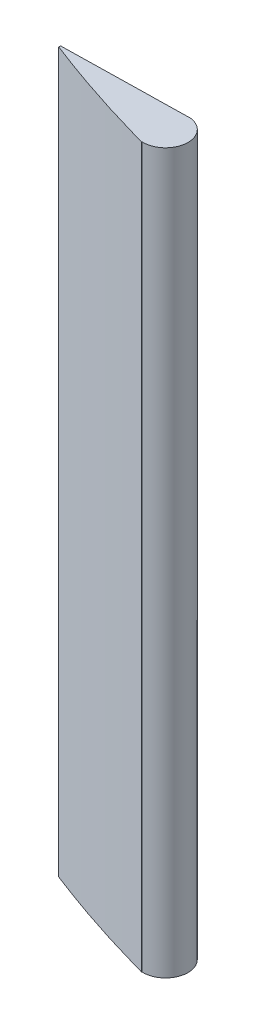
ISO-10303-21;
HEADER;
FILE_DESCRIPTION(('STEP AP214'),'2;1');
FILE_NAME('part.step','',(''),(''),'','','');
FILE_SCHEMA(('AUTOMOTIVE_DESIGN { 1 0 10303 214 1 1 1 1 }'));
ENDSEC;
DATA;
#1=APPLICATION_CONTEXT('core data for automotive mechanical design processes');
#2=APPLICATION_PROTOCOL_DEFINITION('international standard','automotive_design',2000,#1);
#3=PRODUCT_CONTEXT('',#1,'mechanical');
#4=PRODUCT('Part','Part','',(#3));
#5=PRODUCT_RELATED_PRODUCT_CATEGORY('part','',(#4));
#6=PRODUCT_DEFINITION_FORMATION('','',#4);
#7=PRODUCT_DEFINITION_CONTEXT('part definition',#1,'design');
#8=PRODUCT_DEFINITION('design','',#6,#7);
#9=PRODUCT_DEFINITION_SHAPE('','',#8);
#10=(LENGTH_UNIT() NAMED_UNIT(*) SI_UNIT(.MILLI.,.METRE.));
#11=(NAMED_UNIT(*) PLANE_ANGLE_UNIT() SI_UNIT($,.RADIAN.));
#12=(NAMED_UNIT(*) SI_UNIT($,.STERADIAN.) SOLID_ANGLE_UNIT());
#13=UNCERTAINTY_MEASURE_WITH_UNIT(LENGTH_MEASURE(1.E-05),#10,'distance_accuracy_value','');
#14=(GEOMETRIC_REPRESENTATION_CONTEXT(3) GLOBAL_UNCERTAINTY_ASSIGNED_CONTEXT((#13)) GLOBAL_UNIT_ASSIGNED_CONTEXT((#10,
#11,#12)) REPRESENTATION_CONTEXT('',''));
#15=CARTESIAN_POINT('',(0.,0.,0.));
#16=DIRECTION('',(0.,0.,1.));
#17=DIRECTION('',(1.,0.,0.));
#18=AXIS2_PLACEMENT_3D('',#15,#16,#17);
#19=CARTESIAN_POINT('',(-277.614452289,0.,-13.34157566135));
#20=DIRECTION('',(0.984057329439977,0.,0.177851545889996));
#21=DIRECTION('',(0.,-1.,0.));
#22=AXIS2_PLACEMENT_3D('',#19,#20,#21);
#23=PLANE('',#22);
#24=DIRECTION('',(0.,1.,0.));
#25=VECTOR('',#24,1.);
#26=CARTESIAN_POINT('',(-277.790962835,0.,-12.36493812418));
#27=LINE('',#26,#25);
#28=CARTESIAN_POINT('',(-277.790962835,795.,-12.36493812418));
#29=VERTEX_POINT('',#28);
#30=CARTESIAN_POINT('',(-277.790962835,1193.,-12.36493812418));
#31=VERTEX_POINT('',#30);
#32=EDGE_CURVE('E208',#29,#31,#27,.T.);
#33=ORIENTED_EDGE('',*,*,#32,.T.);
#34=DIRECTION('',(-0.177851545889996,0.,0.984057329439977));
#35=VECTOR('',#34,1.);
#36=CARTESIAN_POINT('',(-189.342702508,1193.,-501.751512837));
#37=LINE('',#36,#35);
#38=CARTESIAN_POINT('',(-277.614452289,1193.,-13.34157566135));
#39=VERTEX_POINT('',#38);
#40=EDGE_CURVE('E124',#39,#31,#37,.T.);
#41=ORIENTED_EDGE('',*,*,#40,.F.);
#42=DIRECTION('',(0.,1.,0.));
#43=VECTOR('',#42,1.);
#44=CARTESIAN_POINT('',(-277.614452289,0.,-13.34157566135));
#45=LINE('',#44,#43);
#46=CARTESIAN_POINT('',(-277.614452289,795.,-13.34157566135));
#47=VERTEX_POINT('',#46);
#48=EDGE_CURVE('E122',#47,#39,#45,.T.);
#49=ORIENTED_EDGE('',*,*,#48,.F.);
#50=DIRECTION('',(-0.177851545889996,0.,0.984057329439977));
#51=VECTOR('',#50,1.);
#52=CARTESIAN_POINT('',(-189.342702508,795.,-501.751512837));
#53=LINE('',#52,#51);
#54=EDGE_CURVE('E10',#47,#29,#53,.T.);
#55=ORIENTED_EDGE('',*,*,#54,.T.);
#56=EDGE_LOOP('',(#33,#41,#49,#55));
#57=FACE_BOUND('',#56,.T.);
#58=ADVANCED_FACE('F16',(#57),#23,.F.);
#59=CARTESIAN_POINT('',(-162.381476815,795.,-1001.242279516));
#60=DIRECTION('',(0.,1.,0.));
#61=DIRECTION('',(1.,0.,0.));
#62=AXIS2_PLACEMENT_3D('',#59,#60,#61);
#63=PLANE('',#62);
#64=ORIENTED_EDGE('',*,*,#54,.F.);
#65=CARTESIAN_POINT('',(-208.045610031,795.,-14.63993131042));
#66=CARTESIAN_POINT('',(-221.95802553,795.,-14.31419237014));
#67=CARTESIAN_POINT('',(-235.871308234,795.,-14.02458321565));
#68=CARTESIAN_POINT('',(-249.785431114,795.,-13.77902840236));
#69=CARTESIAN_POINT('',(-263.69996336,794.999999999,-13.56154863641));
#70=CARTESIAN_POINT('',(-277.614452289,795.,-13.34157566135));
#71=B_SPLINE_CURVE_WITH_KNOTS('',5,(#65,#66,#67,#68,#69,#70),.UNSPECIFIED.,.F.,.F.,(6,6),
(0.961450218388,1.961450218388),.UNSPECIFIED.);
#72=CARTESIAN_POINT('',(-208.045610031,795.,-14.63993131042));
#73=VERTEX_POINT('',#72);
#74=EDGE_CURVE('E113',#73,#47,#71,.T.);
#75=ORIENTED_EDGE('',*,*,#74,.F.);
#76=CARTESIAN_POINT('',(-220.518236686,795.,-14.35985853621));
#77=CARTESIAN_POINT('',(-217.023979441,795.,-14.43491208245));
#78=CARTESIAN_POINT('',(-213.52979311,795.,-14.51253140771));
#79=CARTESIAN_POINT('',(-210.035619844,795.,-14.59272614458));
#80=CARTESIAN_POINT('',(-206.541532589,795.,-14.67531544604));
#81=B_SPLINE_CURVE_WITH_KNOTS('',4,(#76,#77,#78,#79,#80),.UNSPECIFIED.,.F.,.F.,(5,5),(0.,1.),.UNSPECIFIED.);
#82=CARTESIAN_POINT('',(-207.078391647,795.,-14.66264704701));
#83=VERTEX_POINT('',#82);
#84=EDGE_CURVE('E133',#73,#83,#81,.T.);
#85=ORIENTED_EDGE('',*,*,#84,.T.);
#86=CARTESIAN_POINT('',(-208.616213839,795.,-2.311676775576));
#87=DIRECTION('',(0.,1.,0.));
#88=DIRECTION('',(-0.998930602740897,0.,-0.0462347370243252));
#89=AXIS2_PLACEMENT_3D('',#86,#87,#88);
#90=CIRCLE('',#89,12.44633937118);
#91=CARTESIAN_POINT('',(-209.191667067,795.,10.1213525144));
#92=VERTEX_POINT('',#91);
#93=EDGE_CURVE('E27',#92,#83,#90,.T.);
#94=ORIENTED_EDGE('',*,*,#93,.F.);
#95=DIRECTION('',(-0.0462347370243252,0.,0.998930602740897));
#96=VECTOR('',#95,1.);
#97=CARTESIAN_POINT('',(-162.381476815,795.,-1001.242279516));
#98=LINE('',#97,#96);
#99=CARTESIAN_POINT('',(-209.199983269,795.,10.30102928659));
#100=VERTEX_POINT('',#99);
#101=EDGE_CURVE('E215',#92,#100,#98,.T.);
#102=ORIENTED_EDGE('',*,*,#101,.T.);
#103=CARTESIAN_POINT('',(-209.199983269,795.,10.30102928659));
#104=CARTESIAN_POINT('',(-223.142222817,795.,6.486699661755));
#105=CARTESIAN_POINT('',(-236.985594532,795.,2.312227236599));
#106=CARTESIAN_POINT('',(-250.720980924,795.,-2.210700410248));
#107=CARTESIAN_POINT('',(-264.331700634,795.,-7.093942072189));
#108=CARTESIAN_POINT('',(-277.790962835,795.,-12.36493812418));
#109=B_SPLINE_CURVE_WITH_KNOTS('',5,(#103,#104,#105,#106,#107,#108),.UNSPECIFIED.,.F.,.F.,(6,6),
(0.,1.),.UNSPECIFIED.);
#110=CARTESIAN_POINT('',(-210.154036032,795.,10.03929349586));
#111=VERTEX_POINT('',#110);
#112=EDGE_CURVE('E40',#100,#111,#109,.T.);
#113=ORIENTED_EDGE('',*,*,#112,.T.);
#114=CARTESIAN_POINT('',(-209.989983704,795.,10.08440304097));
#115=CARTESIAN_POINT('',(-211.665676789,795.,9.623856521893));
#116=CARTESIAN_POINT('',(-213.20873533,795.,9.194627626219));
#117=CARTESIAN_POINT('',(-214.896771427,795.,8.721263877197));
#118=CARTESIAN_POINT('',(-216.807833883,795.,8.180761499775));
#119=CARTESIAN_POINT('',(-218.81984591,795.,7.599671173349));
#120=CARTESIAN_POINT('',(-220.580187066,795.,7.084938260405));
#121=CARTESIAN_POINT('',(-221.498331004,795.,6.81569627019));
#122=B_SPLINE_CURVE_WITH_KNOTS('',7,(#114,#115,#116,#117,#118,#119,#120,#121),.UNSPECIFIED.,.F.,
.F.,(8,8),(0.,1.),.UNSPECIFIED.);
#123=CARTESIAN_POINT('',(-213.671536924,795.,9.061760359059));
#124=VERTEX_POINT('',#123);
#125=EDGE_CURVE('E49',#111,#124,#122,.T.);
#126=ORIENTED_EDGE('',*,*,#125,.T.);
#127=CARTESIAN_POINT('',(-209.199983269,795.,10.30102928659));
#128=CARTESIAN_POINT('',(-223.142222817,795.,6.486699661755));
#129=CARTESIAN_POINT('',(-236.985594532,795.,2.312227236599));
#130=CARTESIAN_POINT('',(-250.720980924,795.,-2.210700410248));
#131=CARTESIAN_POINT('',(-264.331700634,795.,-7.093942072189));
#132=CARTESIAN_POINT('',(-277.790962835,795.,-12.36493812418));
#133=B_SPLINE_CURVE_WITH_KNOTS('',5,(#127,#128,#129,#130,#131,#132),.UNSPECIFIED.,.F.,.F.,(6,6),
(0.,1.),.UNSPECIFIED.);
#134=EDGE_CURVE('E118',#124,#29,#133,.T.);
#135=ORIENTED_EDGE('',*,*,#134,.T.);
#136=EDGE_LOOP('',(#64,#75,#85,#94,#102,#113,#126,#135));
#137=FACE_BOUND('',#136,.T.);
#138=ADVANCED_FACE('F117',(#137),#63,.F.);
#139=CARTESIAN_POINT('',(-208.616213839,795.,-2.311676775576));
#140=DIRECTION('',(0.,1.,0.));
#141=DIRECTION('',(-0.998930602740897,0.,-0.0462347370243252));
#142=AXIS2_PLACEMENT_3D('',#139,#140,#141);
#143=CYLINDRICAL_SURFACE('',#142,12.44633937118);
#144=CARTESIAN_POINT('',(-208.616213839,1193.,-2.311676775576));
#145=DIRECTION('',(0.,1.,0.));
#146=DIRECTION('',(-0.998930602740897,0.,-0.0462347370243252));
#147=AXIS2_PLACEMENT_3D('',#144,#145,#146);
#148=CIRCLE('',#147,12.44633937118);
#149=CARTESIAN_POINT('',(-209.191667067,1193.,10.1213525144));
#150=VERTEX_POINT('',#149);
#151=CARTESIAN_POINT('',(-207.078391647,1193.,-14.66264704701));
#152=VERTEX_POINT('',#151);
#153=EDGE_CURVE('E176',#150,#152,#148,.T.);
#154=ORIENTED_EDGE('',*,*,#153,.F.);
#155=DIRECTION('',(0.,1.,0.));
#156=VECTOR('',#155,1.);
#157=CARTESIAN_POINT('',(-209.191667067,795.,10.1213525144));
#158=LINE('',#157,#156);
#159=EDGE_CURVE('E86',#92,#150,#158,.T.);
#160=ORIENTED_EDGE('',*,*,#159,.F.);
#161=ORIENTED_EDGE('',*,*,#93,.T.);
#162=DIRECTION('',(0.,-1.,0.));
#163=VECTOR('',#162,1.);
#164=CARTESIAN_POINT('',(-207.078391647,994.,-14.66264704701));
#165=LINE('',#164,#163);
#166=EDGE_CURVE('E139',#152,#83,#165,.T.);
#167=ORIENTED_EDGE('',*,*,#166,.F.);
#168=EDGE_LOOP('',(#154,#160,#161,#167));
#169=FACE_BOUND('',#168,.T.);
#170=ADVANCED_FACE('F183',(#169),#143,.T.);
#171=CARTESIAN_POINT('',(-277.790962835,0.,-12.36493812418));
#172=CARTESIAN_POINT('',(-277.744973186,0.,-12.34692738532));
#173=CARTESIAN_POINT('',(-277.561106082,0.,-12.27494530144));
#174=CARTESIAN_POINT('',(-277.1477034,0.,-12.11332731371));
#175=CARTESIAN_POINT('',(-276.459443882,0.,-11.84500176562));
#176=CARTESIAN_POINT('',(-275.497447069,0.,-11.47151360626));
#177=CARTESIAN_POINT('',(-274.263284413,0.,-10.99500266933));
#178=CARTESIAN_POINT('',(-272.758983102,0.,-10.41818127208));
#179=CARTESIAN_POINT('',(-270.987030587,0.,-9.744306379292));
#180=CARTESIAN_POINT('',(-268.950379561,0.,-8.977147012475));
#181=CARTESIAN_POINT('',(-266.652453086,0.,-8.120947688363));
#182=CARTESIAN_POINT('',(-264.097149557,0.,-7.180388748758));
#183=CARTESIAN_POINT('',(-261.28884719,0.,-6.160544493137));
#184=CARTESIAN_POINT('',(-258.232407709,0.,-5.066840044441));
#185=CARTESIAN_POINT('',(-254.933178951,0.,-3.905007866358));
#186=CARTESIAN_POINT('',(-251.396996135,0.,-2.681044807612));
#187=CARTESIAN_POINT('',(-247.630181571,0.,-1.401170476502));
#188=CARTESIAN_POINT('',(-243.63954265,0.,-0.07178764989044));
#189=CARTESIAN_POINT('',(-239.432368018,0.,1.30055470179));
#190=CARTESIAN_POINT('',(-235.016421851,0.,2.709195333651));
#191=CARTESIAN_POINT('',(-230.399936265,0.,4.14739130551));
#192=CARTESIAN_POINT('',(-225.591601885,0.,5.608345101185));
#193=CARTESIAN_POINT('',(-220.600556673,0.,7.08522833435));
#194=CARTESIAN_POINT('',(-215.436373143,0.,8.571202249735));
#195=CARTESIAN_POINT('',(-210.109044091,0.,10.05943538031));
#196=CARTESIAN_POINT('',(-204.628967015,0.,11.54311885658));
#197=CARTESIAN_POINT('',(-199.006927349,0.,13.0154799777));
#198=CARTESIAN_POINT('',(-193.254080665,0.,14.46979473988));
#199=CARTESIAN_POINT('',(-187.381933944,0.,15.89940007695));
#200=CARTESIAN_POINT('',(-181.40232598,0.,17.29770657483));
#201=CARTESIAN_POINT('',(-175.32740697,0.,18.65821246672));
#202=CARTESIAN_POINT('',(-169.169617251,0.,19.9745194428));
#203=CARTESIAN_POINT('',(-162.941665202,0.,21.2403515752));
#204=CARTESIAN_POINT('',(-156.656503954,0.,22.44957531771));
#205=CARTESIAN_POINT('',(-150.327307727,0.,23.59623057339));
#206=CARTESIAN_POINT('',(-143.967444154,0.,24.67453680684));
#207=CARTESIAN_POINT('',(-137.590455384,0.,25.67901003473));
#208=CARTESIAN_POINT('',(-131.209999412,0.,26.6041827417));
#209=CARTESIAN_POINT('',(-124.839931736,0.,27.44581862981));
#210=CARTESIAN_POINT('',(-118.490230515,0.,28.19702049469));
#211=CARTESIAN_POINT('',(-112.132369818,0.,28.86796763448));
#212=CARTESIAN_POINT('',(-105.775838021,0.,29.41079689502));
#213=CARTESIAN_POINT('',(-99.43923716981,0.,29.81746624895));
#214=CARTESIAN_POINT('',(-93.18136217169,0.,30.08367051689));
#215=CARTESIAN_POINT('',(-87.01774011655,0.,30.20885693733));
#216=CARTESIAN_POINT('',(-80.96376576612,0.,30.19360844519));
#217=CARTESIAN_POINT('',(-75.03462528456,0.,30.03937367309));
#218=CARTESIAN_POINT('',(-69.24522202999,0.,29.74853634422));
#219=CARTESIAN_POINT('',(-63.61010156687,0.,29.32438173736));
#220=CARTESIAN_POINT('',(-58.14337820376,0.,28.77107503053));
#221=CARTESIAN_POINT('',(-52.85866402519,0.,28.09362105286));
#222=CARTESIAN_POINT('',(-47.76900167799,0.,27.29781313147));
#223=CARTESIAN_POINT('',(-42.88680197387,0.,26.39016915672));
#224=CARTESIAN_POINT('',(-38.22378723374,0.,25.37785579253));
#225=CARTESIAN_POINT('',(-33.79094108545,0.,24.26860134071));
#226=CARTESIAN_POINT('',(-29.59846517773,0.,23.07059812578));
#227=CARTESIAN_POINT('',(-25.65574299071,0.,21.79239533509));
#228=CARTESIAN_POINT('',(-21.97131062977,0.,20.44278324209));
#229=CARTESIAN_POINT('',(-18.55283423047,0.,19.03066951757));
#230=CARTESIAN_POINT('',(-15.40709348294,0.,17.56494778897));
#231=CARTESIAN_POINT('',(-12.53997104634,0.,16.05435757783));
#232=CARTESIAN_POINT('',(-9.956448842308,0.,14.50733300725));
#233=CARTESIAN_POINT('',(-7.660615566151,0.,12.93183535483));
#234=CARTESIAN_POINT('',(-5.65569791333,0.,11.33516221027));
#235=CARTESIAN_POINT('',(-3.944144494428,0.,9.72372949223));
#236=CARTESIAN_POINT('',(-2.527821644869,0.,8.102841005203));
#237=CARTESIAN_POINT('',(-1.408404468768,0.,6.476540236706));
#238=CARTESIAN_POINT('',(-0.5880088819267,0.,4.847767580905));
#239=CARTESIAN_POINT('',(-0.06973237158088,0.,3.219296659078));
#240=CARTESIAN_POINT('',(0.1427738142601,0.,1.595214038848));
#241=CARTESIAN_POINT('',(0.04859892299523,0.,-0.007416129881715));
#242=CARTESIAN_POINT('',(-0.3384920229515,0.,-1.564948537118));
#243=CARTESIAN_POINT('',(-1.019457406476,0.,-3.052219941554));
#244=CARTESIAN_POINT('',(-1.984015125554,0.,-4.455832877205));
#245=CARTESIAN_POINT('',(-3.223954362739,0.,-5.776158876449));
#246=CARTESIAN_POINT('',(-4.73240940269,0.,-7.015088490999));
#247=CARTESIAN_POINT('',(-6.503677925528,0.,-8.174644460989));
#248=CARTESIAN_POINT('',(-8.53248217228,0.,-9.256352119566));
#249=CARTESIAN_POINT('',(-10.81342199331,0.,-10.26127352257));
#250=CARTESIAN_POINT('',(-13.3407261188,0.,-11.19020500488));
#251=CARTESIAN_POINT('',(-16.10818847445,0.,-12.04387588279));
#252=CARTESIAN_POINT('',(-19.10919016709,0.,-12.82309687167));
#253=CARTESIAN_POINT('',(-22.33675196315,0.,-13.52886506394));
#254=CARTESIAN_POINT('',(-25.78359261934,0.,-14.16243798038));
#255=CARTESIAN_POINT('',(-29.4421832632,0.,-14.72538727395));
#256=CARTESIAN_POINT('',(-33.30479440721,0.,-15.21963830574));
#257=CARTESIAN_POINT('',(-37.36353462985,0.,-15.64749886971));
#258=CARTESIAN_POINT('',(-41.6103808351,0.,-16.01167848587));
#259=CARTESIAN_POINT('',(-46.03720030663,0.,-16.31529869432));
#260=CARTESIAN_POINT('',(-50.63576490998,0.,-16.56189431119));
#261=CARTESIAN_POINT('',(-55.39775790565,0.,-16.75540545488));
#262=CARTESIAN_POINT('',(-60.31477395935,0.,-16.90016017131));
#263=CARTESIAN_POINT('',(-65.37831307247,0.,-17.00084765878));
#264=CARTESIAN_POINT('',(-70.57976929502,0.,-17.06248216119));
#265=CARTESIAN_POINT('',(-75.91041521155,0.,-17.09035834259));
#266=CARTESIAN_POINT('',(-81.36138329515,0.,-17.08999721928));
#267=CARTESIAN_POINT('',(-86.92364529523,0.,-17.06708962574));
#268=CARTESIAN_POINT('',(-92.58799085732,0.,-17.02741492624));
#269=CARTESIAN_POINT('',(-98.34500655552,0.,-16.97682613026));
#270=CARTESIAN_POINT('',(-104.18505648,0.,-16.92095920026));
#271=CARTESIAN_POINT('',(-110.141567937,0.,-16.86557677972));
#272=CARTESIAN_POINT('',(-116.207374915,0.,-16.81427226161));
#273=CARTESIAN_POINT('',(-122.370475868,0.,-16.72822987277));
#274=CARTESIAN_POINT('',(-128.575353667,0.,-16.62236484523));
#275=CARTESIAN_POINT('',(-134.806107382,0.,-16.49774518504));
#276=CARTESIAN_POINT('',(-141.050382512,0.,-16.35885051196));
#277=CARTESIAN_POINT('',(-147.295704014,0.,-16.20894970595));
#278=CARTESIAN_POINT('',(-153.529509842,0.,-16.05131540454));
#279=CARTESIAN_POINT('',(-159.739173629,0.,-15.88885999828));
#280=CARTESIAN_POINT('',(-165.912031995,0.,-15.72420585599));
#281=CARTESIAN_POINT('',(-172.035411958,0.,-15.55964916417));
#282=CARTESIAN_POINT('',(-178.096659325,0.,-15.39716211333));
#283=CARTESIAN_POINT('',(-184.083167476,0.,-15.23839439758));
#284=CARTESIAN_POINT('',(-189.982406392,0.,-15.08468378004));
#285=CARTESIAN_POINT('',(-195.781951711,0.,-14.93707226427));
#286=CARTESIAN_POINT('',(-201.469513646,0.,-14.79632772258));
#287=CARTESIAN_POINT('',(-207.032965662,0.,-14.66296980565));
#288=CARTESIAN_POINT('',(-212.460372858,0.,-14.53729912374));
#289=CARTESIAN_POINT('',(-217.740020014,0.,-14.41942858913));
#290=CARTESIAN_POINT('',(-222.860439344,0.,-14.30931582756));
#291=CARTESIAN_POINT('',(-227.810437995,0.,-14.20679559938));
#292=CARTESIAN_POINT('',(-232.579125356,0.,-14.1116112441));
#293=CARTESIAN_POINT('',(-237.15594027,0.,-14.02344426294));
#294=CARTESIAN_POINT('',(-241.530678195,0.,-13.9419412808));
#295=CARTESIAN_POINT('',(-245.693518394,0.,-13.86673777558));
#296=CARTESIAN_POINT('',(-249.635051162,0.,-13.7974781227));
#297=CARTESIAN_POINT('',(-253.346305081,0.,-13.73383167029));
#298=CARTESIAN_POINT('',(-256.81877426,0.,-13.67550472917));
#299=CARTESIAN_POINT('',(-260.044445434,0.,-13.62224852547));
#300=CARTESIAN_POINT('',(-263.015824783,0.,-13.57386331636));
#301=CARTESIAN_POINT('',(-265.725964262,0.,-13.53019900667));
#302=CARTESIAN_POINT('',(-268.168487179,0.,-13.49115272023));
#303=CARTESIAN_POINT('',(-270.337612755,0.,-13.45666387259));
#304=CARTESIAN_POINT('',(-272.22817933,0.,-13.42670735731));
#305=CARTESIAN_POINT('',(-273.835665889,0.,-13.40128549588));
#306=CARTESIAN_POINT('',(-275.156211576,0.,-13.38041940966));
#307=CARTESIAN_POINT('',(-276.18663286,0.,-13.36414045286));
#308=CARTESIAN_POINT('',(-276.924438042,0.,-13.35248229888));
#309=CARTESIAN_POINT('',(-277.367838859,0.,-13.34547420142));
#310=CARTESIAN_POINT('',(-277.565105605,0.,-13.34235577889));
#311=CARTESIAN_POINT('',(-277.614452289,0.,-13.34157566135));
#312=(BOUNDED_CURVE() B_SPLINE_CURVE(3,(#171,#172,#173,#174,#175,#176,#177,#178,#179,#180,#181,
#182,#183,#184,#185,#186,#187,#188,#189,#190,#191,#192,#193,#194,#195,#196,#197,#198,#199,#200,
#201,#202,#203,#204,#205,#206,#207,#208,#209,#210,#211,#212,#213,#214,#215,#216,#217,#218,#219,
#220,#221,#222,#223,#224,#225,#226,#227,#228,#229,#230,#231,#232,#233,#234,#235,#236,#237,#238,
#239,#240,#241,#242,#243,#244,#245,#246,#247,#248,#249,#250,#251,#252,#253,#254,#255,#256,#257,
#258,#259,#260,#261,#262,#263,#264,#265,#266,#267,#268,#269,#270,#271,#272,#273,#274,#275,#276,
#277,#278,#279,#280,#281,#282,#283,#284,#285,#286,#287,#288,#289,#290,#291,#292,#293,#294,#295,
#296,#297,#298,#299,#300,#301,#302,#303,#304,#305,#306,#307,#308,#309,#310,#311),.UNSPECIFIED.,
.F.,.F.) B_SPLINE_CURVE_WITH_KNOTS((4,1,1,1,1,1,1,1,1,1,1,1,1,1,1,1,1,1,1,1,1,1,1,1,1,1,1,1,1,1,
1,1,1,1,1,1,1,1,1,1,1,1,1,1,1,1,1,1,1,1,1,1,1,1,1,1,1,1,1,1,1,1,1,1,1,1,1,1,1,1,1,1,1,1,1,1,1,1,
1,1,1,1,1,1,1,1,1,1,1,1,1,1,1,1,1,1,1,1,1,1,1,1,1,1,1,1,1,1,1,1,1,1,1,1,1,1,1,1,1,1,1,1,1,1,1,1,
1,1,1,1,1,1,1,1,1,1,1,1,4),(0.,0.0001481718954734,0.0005923654143001,0.001331615210704,
0.002364316206764,0.00368822925388,0.005300488891255,0.007197613044255,0.009375514474748,
0.01182951377393,0.01455435367653,0.01754421447371,0.02079273030986,0.02429300616489,
0.02803763534736,0.03201871735284,0.0362278759748,0.04065627759064,0.04529464958107,
0.05013329887643,0.05516213065662,0.06037066726292,0.06574806740765,0.07128314579246,
0.07696439326713,0.08277999767725,0.08871786556146,0.09476564486526,0.100910748839,
0.107140381281,0.113441563272,0.119801161519,0.126205918408,0.132642483799,0.139097448567,
0.145557379828,0.152008857715,0.15843851353,0.164833068999,0.171190333115,0.177617185483,
0.183970606283,0.190237820566,0.196406284155,0.202463723868,0.20839817815,0.21419803797,
0.219852087944,0.225349547869,0.230680115071,0.235834008322,0.24080201445,0.245575539312,
0.250146665427,0.254508219463,0.258653853952,0.262578149265,0.266276744259,0.269746507384,
0.27298576502,0.275994610817,0.278775329496,0.281332980666,0.283676199751,0.285818273564,
0.287778508911,0.289583774551,0.291269782335,0.292881212262,0.294469596335,0.296057943967,
0.297668411557,0.299350209222,0.301144821972,0.303084498202,0.305192758804,0.307485848987,
0.309974331745,0.312664462177,0.315559258549,0.318659300712,0.321963315518,0.325468605032,
0.329171361043,0.333066897481,0.337149823045,0.341414169706,0.345853488194,0.350460918438,
0.355229240877,0.36015091309,0.365218095244,0.370422667128,0.375756239019,0.381210158238,
0.386775512877,0.392443133946,0.398203596894,0.404047223277,0.409964083134,0.416073911921,
0.42224525652,0.428455111618,0.434691237358,0.440941231262,0.447192559843,0.453432590524,
0.459648623579,0.465827923857,0.471957752086,0.478025395617,0.484018198522,0.489923591004,
0.495729118122,0.501422467876,0.506991498729,0.512424266658,0.51770905185,0.522834385163,
0.527789074461,0.532562230946,0.53714329557,0.541522065602,0.545688721384,0.549633853296,
0.553348488873,0.55682412001,0.560052730126,0.563026821098,0.565739439762,0.568184203708,
0.57035532607,0.572247638987,0.573856615389,0.575178388767,0.57620977058,0.576948264985,
0.577392080616,0.577540139166),
.UNSPECIFIED.) CURVE() GEOMETRIC_REPRESENTATION_ITEM() RATIONAL_B_SPLINE_CURVE((1.,1.,1.,1.,1.,
1.,1.,1.,1.,1.,1.,1.,1.,1.,1.,1.,1.,1.,1.,1.,1.,1.,1.,1.,1.,1.,1.,1.,1.,1.,1.,1.,1.,1.,1.,1.,1.,
1.,1.,1.,1.,1.,1.,1.,1.,1.,1.,1.,1.,1.,1.,1.,1.,1.,1.,1.,1.,1.,1.,1.,1.,1.,1.,1.,1.,1.,1.,1.,1.,
1.,1.,1.,1.,1.,1.,1.,1.,1.,1.,1.,1.,1.,1.,1.,1.,1.,1.,1.,1.,1.,1.,1.,1.,1.,1.,1.,1.,1.,1.,1.,1.,
1.,1.,1.,1.,1.,1.,1.,1.,1.,1.,1.,1.,1.,1.,1.,1.,1.,1.,1.,1.,1.,1.,1.,1.,1.,1.,1.,1.,1.,1.,1.,1.,
1.,1.,1.,1.,1.,1.,1.,1.)) REPRESENTATION_ITEM(''));
#313=DIRECTION('',(0.,-1.,0.));
#314=VECTOR('',#313,1.);
#315=SURFACE_OF_LINEAR_EXTRUSION('',#312,#314);
#316=ORIENTED_EDGE('',*,*,#32,.F.);
#317=ORIENTED_EDGE('',*,*,#134,.F.);
#318=ORIENTED_EDGE('',*,*,#125,.F.);
#319=ORIENTED_EDGE('',*,*,#112,.F.);
#320=DIRECTION('',(0.,-1.,0.));
#321=VECTOR('',#320,1.);
#322=CARTESIAN_POINT('',(-209.199983269,994.,10.30102928659));
#323=LINE('',#322,#321);
#324=CARTESIAN_POINT('',(-209.199983269,1193.,10.30102928659));
#325=VERTEX_POINT('',#324);
#326=EDGE_CURVE('E209',#325,#100,#323,.T.);
#327=ORIENTED_EDGE('',*,*,#326,.F.);
#328=CARTESIAN_POINT('',(-209.199983269,1193.,10.30102928659));
#329=CARTESIAN_POINT('',(-223.142222817,1193.,6.486699661755));
#330=CARTESIAN_POINT('',(-236.985594532,1193.,2.312227236599));
#331=CARTESIAN_POINT('',(-250.720980924,1193.,-2.210700410248));
#332=CARTESIAN_POINT('',(-264.331700634,1193.,-7.093942072189));
#333=CARTESIAN_POINT('',(-277.790962835,1193.,-12.36493812418));
#334=B_SPLINE_CURVE_WITH_KNOTS('',5,(#328,#329,#330,#331,#332,#333),.UNSPECIFIED.,.F.,.F.,(6,6),
(0.,1.),.UNSPECIFIED.);
#335=CARTESIAN_POINT('',(-210.154036032,1193.,10.03929349586));
#336=VERTEX_POINT('',#335);
#337=EDGE_CURVE('E216',#325,#336,#334,.T.);
#338=ORIENTED_EDGE('',*,*,#337,.T.);
#339=CARTESIAN_POINT('',(-209.989983704,1193.,10.08440304097));
#340=CARTESIAN_POINT('',(-211.665676789,1193.,9.623856521893));
#341=CARTESIAN_POINT('',(-213.20873533,1193.,9.194627626219));
#342=CARTESIAN_POINT('',(-214.896771427,1193.,8.721263877197));
#343=CARTESIAN_POINT('',(-216.807833883,1193.,8.180761499775));
#344=CARTESIAN_POINT('',(-218.81984591,1193.,7.599671173349));
#345=CARTESIAN_POINT('',(-220.580187066,1193.,7.084938260405));
#346=CARTESIAN_POINT('',(-221.498331004,1193.,6.81569627019));
#347=B_SPLINE_CURVE_WITH_KNOTS('',7,(#339,#340,#341,#342,#343,#344,#345,#346),.UNSPECIFIED.,.F.,
.F.,(8,8),(0.,1.),.UNSPECIFIED.);
#348=CARTESIAN_POINT('',(-213.671536924,1193.,9.061760359059));
#349=VERTEX_POINT('',#348);
#350=EDGE_CURVE('E219',#336,#349,#347,.T.);
#351=ORIENTED_EDGE('',*,*,#350,.T.);
#352=CARTESIAN_POINT('',(-209.199983269,1193.,10.30102928659));
#353=CARTESIAN_POINT('',(-223.142222817,1193.,6.486699661755));
#354=CARTESIAN_POINT('',(-236.985594532,1193.,2.312227236599));
#355=CARTESIAN_POINT('',(-250.720980924,1193.,-2.210700410248));
#356=CARTESIAN_POINT('',(-264.331700634,1193.,-7.093942072189));
#357=CARTESIAN_POINT('',(-277.790962835,1193.,-12.36493812418));
#358=B_SPLINE_CURVE_WITH_KNOTS('',5,(#352,#353,#354,#355,#356,#357),.UNSPECIFIED.,.F.,.F.,(6,6),
(0.,1.),.UNSPECIFIED.);
#359=EDGE_CURVE('E129',#349,#31,#358,.T.);
#360=ORIENTED_EDGE('',*,*,#359,.T.);
#361=EDGE_LOOP('',(#316,#317,#318,#319,#327,#338,#351,#360));
#362=FACE_BOUND('',#361,.T.);
#363=ADVANCED_FACE('F233',(#362),#315,.F.);
#364=CARTESIAN_POINT('',(-162.381476815,795.,-1001.242279516));
#365=DIRECTION('',(-0.998930602740897,0.,-0.0462347370243252));
#366=DIRECTION('',(-0.0462347370243252,0.,0.998930602740897));
#367=AXIS2_PLACEMENT_3D('',#364,#365,#366);
#368=PLANE('',#367);
#369=ORIENTED_EDGE('',*,*,#326,.T.);
#370=ORIENTED_EDGE('',*,*,#101,.F.);
#371=ORIENTED_EDGE('',*,*,#159,.T.);
#372=DIRECTION('',(-0.0462347370243252,0.,0.998930602740897));
#373=VECTOR('',#372,1.);
#374=CARTESIAN_POINT('',(-162.381476815,1193.,-1001.242279516));
#375=LINE('',#374,#373);
#376=EDGE_CURVE('E179',#150,#325,#375,.T.);
#377=ORIENTED_EDGE('',*,*,#376,.T.);
#378=EDGE_LOOP('',(#369,#370,#371,#377));
#379=FACE_BOUND('',#378,.T.);
#380=ADVANCED_FACE('F234',(#379),#368,.F.);
#381=CARTESIAN_POINT('',(-162.381476815,1193.,-1001.242279516));
#382=DIRECTION('',(0.,1.,0.));
#383=DIRECTION('',(1.,0.,0.));
#384=AXIS2_PLACEMENT_3D('',#381,#382,#383);
#385=PLANE('',#384);
#386=ORIENTED_EDGE('',*,*,#359,.F.);
#387=ORIENTED_EDGE('',*,*,#350,.F.);
#388=ORIENTED_EDGE('',*,*,#337,.F.);
#389=ORIENTED_EDGE('',*,*,#376,.F.);
#390=ORIENTED_EDGE('',*,*,#153,.T.);
#391=CARTESIAN_POINT('',(-220.518236686,1193.,-14.35985853621));
#392=CARTESIAN_POINT('',(-217.023979441,1193.,-14.43491208245));
#393=CARTESIAN_POINT('',(-213.52979311,1193.,-14.51253140771));
#394=CARTESIAN_POINT('',(-210.035619844,1193.,-14.59272614458));
#395=CARTESIAN_POINT('',(-206.541532589,1193.,-14.67531544604));
#396=B_SPLINE_CURVE_WITH_KNOTS('',4,(#391,#392,#393,#394,#395),.UNSPECIFIED.,.F.,.F.,(5,5),(0.,
1.),.UNSPECIFIED.);
#397=CARTESIAN_POINT('',(-208.045610031,1193.,-14.63993131042));
#398=VERTEX_POINT('',#397);
#399=EDGE_CURVE('E157',#398,#152,#396,.T.);
#400=ORIENTED_EDGE('',*,*,#399,.F.);
#401=CARTESIAN_POINT('',(-277.614452289,1193.,-13.34157566135));
#402=CARTESIAN_POINT('',(-263.699963366,1193.,-13.56154863584));
#403=CARTESIAN_POINT('',(-249.785431114,1193.,-13.77902840237));
#404=CARTESIAN_POINT('',(-235.871308234,1193.,-14.02458321565));
#405=CARTESIAN_POINT('',(-221.95802553,1193.,-14.31419237014));
#406=CARTESIAN_POINT('',(-208.045610031,1193.,-14.63993131042));
#407=B_SPLINE_CURVE_WITH_KNOTS('',5,(#401,#402,#403,#404,#405,#406),.UNSPECIFIED.,.F.,.F.,(6,6),
(0.,1.),.UNSPECIFIED.);
#408=EDGE_CURVE('E19',#39,#398,#407,.T.);
#409=ORIENTED_EDGE('',*,*,#408,.F.);
#410=ORIENTED_EDGE('',*,*,#40,.T.);
#411=EDGE_LOOP('',(#386,#387,#388,#389,#390,#400,#409,#410));
#412=FACE_BOUND('',#411,.T.);
#413=ADVANCED_FACE('F173',(#412),#385,.T.);
#414=CARTESIAN_POINT('',(-277.790962835,0.,-12.36493812418));
#415=CARTESIAN_POINT('',(-277.744973186,0.,-12.34692738532));
#416=CARTESIAN_POINT('',(-277.561106082,0.,-12.27494530144));
#417=CARTESIAN_POINT('',(-277.1477034,0.,-12.11332731371));
#418=CARTESIAN_POINT('',(-276.459443882,0.,-11.84500176562));
#419=CARTESIAN_POINT('',(-275.497447069,0.,-11.47151360626));
#420=CARTESIAN_POINT('',(-274.263284413,0.,-10.99500266933));
#421=CARTESIAN_POINT('',(-272.758983102,0.,-10.41818127208));
#422=CARTESIAN_POINT('',(-270.987030587,0.,-9.744306379292));
#423=CARTESIAN_POINT('',(-268.950379561,0.,-8.977147012475));
#424=CARTESIAN_POINT('',(-266.652453086,0.,-8.120947688363));
#425=CARTESIAN_POINT('',(-264.097149557,0.,-7.180388748758));
#426=CARTESIAN_POINT('',(-261.28884719,0.,-6.160544493137));
#427=CARTESIAN_POINT('',(-258.232407709,0.,-5.066840044441));
#428=CARTESIAN_POINT('',(-254.933178951,0.,-3.905007866358));
#429=CARTESIAN_POINT('',(-251.396996135,0.,-2.681044807612));
#430=CARTESIAN_POINT('',(-247.630181571,0.,-1.401170476502));
#431=CARTESIAN_POINT('',(-243.63954265,0.,-0.07178764989044));
#432=CARTESIAN_POINT('',(-239.432368018,0.,1.30055470179));
#433=CARTESIAN_POINT('',(-235.016421851,0.,2.709195333651));
#434=CARTESIAN_POINT('',(-230.399936265,0.,4.14739130551));
#435=CARTESIAN_POINT('',(-225.591601885,0.,5.608345101185));
#436=CARTESIAN_POINT('',(-220.600556673,0.,7.08522833435));
#437=CARTESIAN_POINT('',(-215.436373143,0.,8.571202249735));
#438=CARTESIAN_POINT('',(-210.109044091,0.,10.05943538031));
#439=CARTESIAN_POINT('',(-204.628967015,0.,11.54311885658));
#440=CARTESIAN_POINT('',(-199.006927349,0.,13.0154799777));
#441=CARTESIAN_POINT('',(-193.254080665,0.,14.46979473988));
#442=CARTESIAN_POINT('',(-187.381933944,0.,15.89940007695));
#443=CARTESIAN_POINT('',(-181.40232598,0.,17.29770657483));
#444=CARTESIAN_POINT('',(-175.32740697,0.,18.65821246672));
#445=CARTESIAN_POINT('',(-169.169617251,0.,19.9745194428));
#446=CARTESIAN_POINT('',(-162.941665202,0.,21.2403515752));
#447=CARTESIAN_POINT('',(-156.656503954,0.,22.44957531771));
#448=CARTESIAN_POINT('',(-150.327307727,0.,23.59623057339));
#449=CARTESIAN_POINT('',(-143.967444154,0.,24.67453680684));
#450=CARTESIAN_POINT('',(-137.590455384,0.,25.67901003473));
#451=CARTESIAN_POINT('',(-131.209999412,0.,26.6041827417));
#452=CARTESIAN_POINT('',(-124.839931736,0.,27.44581862981));
#453=CARTESIAN_POINT('',(-118.490230515,0.,28.19702049469));
#454=CARTESIAN_POINT('',(-112.132369818,0.,28.86796763448));
#455=CARTESIAN_POINT('',(-105.775838021,0.,29.41079689502));
#456=CARTESIAN_POINT('',(-99.43923716981,0.,29.81746624895));
#457=CARTESIAN_POINT('',(-93.18136217169,0.,30.08367051689));
#458=CARTESIAN_POINT('',(-87.01774011655,0.,30.20885693733));
#459=CARTESIAN_POINT('',(-80.96376576612,0.,30.19360844519));
#460=CARTESIAN_POINT('',(-75.03462528456,0.,30.03937367309));
#461=CARTESIAN_POINT('',(-69.24522202999,0.,29.74853634422));
#462=CARTESIAN_POINT('',(-63.61010156687,0.,29.32438173736));
#463=CARTESIAN_POINT('',(-58.14337820376,0.,28.77107503053));
#464=CARTESIAN_POINT('',(-52.85866402519,0.,28.09362105286));
#465=CARTESIAN_POINT('',(-47.76900167799,0.,27.29781313147));
#466=CARTESIAN_POINT('',(-42.88680197387,0.,26.39016915672));
#467=CARTESIAN_POINT('',(-38.22378723374,0.,25.37785579253));
#468=CARTESIAN_POINT('',(-33.79094108545,0.,24.26860134071));
#469=CARTESIAN_POINT('',(-29.59846517773,0.,23.07059812578));
#470=CARTESIAN_POINT('',(-25.65574299071,0.,21.79239533509));
#471=CARTESIAN_POINT('',(-21.97131062977,0.,20.44278324209));
#472=CARTESIAN_POINT('',(-18.55283423047,0.,19.03066951757));
#473=CARTESIAN_POINT('',(-15.40709348294,0.,17.56494778897));
#474=CARTESIAN_POINT('',(-12.53997104634,0.,16.05435757783));
#475=CARTESIAN_POINT('',(-9.956448842308,0.,14.50733300725));
#476=CARTESIAN_POINT('',(-7.660615566151,0.,12.93183535483));
#477=CARTESIAN_POINT('',(-5.65569791333,0.,11.33516221027));
#478=CARTESIAN_POINT('',(-3.944144494428,0.,9.72372949223));
#479=CARTESIAN_POINT('',(-2.527821644869,0.,8.102841005203));
#480=CARTESIAN_POINT('',(-1.408404468768,0.,6.476540236706));
#481=CARTESIAN_POINT('',(-0.5880088819267,0.,4.847767580905));
#482=CARTESIAN_POINT('',(-0.06973237158088,0.,3.219296659078));
#483=CARTESIAN_POINT('',(0.1427738142601,0.,1.595214038848));
#484=CARTESIAN_POINT('',(0.04859892299523,0.,-0.007416129881715));
#485=CARTESIAN_POINT('',(-0.3384920229515,0.,-1.564948537118));
#486=CARTESIAN_POINT('',(-1.019457406476,0.,-3.052219941554));
#487=CARTESIAN_POINT('',(-1.984015125554,0.,-4.455832877205));
#488=CARTESIAN_POINT('',(-3.223954362739,0.,-5.776158876449));
#489=CARTESIAN_POINT('',(-4.73240940269,0.,-7.015088490999));
#490=CARTESIAN_POINT('',(-6.503677925528,0.,-8.174644460989));
#491=CARTESIAN_POINT('',(-8.53248217228,0.,-9.256352119566));
#492=CARTESIAN_POINT('',(-10.81342199331,0.,-10.26127352257));
#493=CARTESIAN_POINT('',(-13.3407261188,0.,-11.19020500488));
#494=CARTESIAN_POINT('',(-16.10818847445,0.,-12.04387588279));
#495=CARTESIAN_POINT('',(-19.10919016709,0.,-12.82309687167));
#496=CARTESIAN_POINT('',(-22.33675196315,0.,-13.52886506394));
#497=CARTESIAN_POINT('',(-25.78359261934,0.,-14.16243798038));
#498=CARTESIAN_POINT('',(-29.4421832632,0.,-14.72538727395));
#499=CARTESIAN_POINT('',(-33.30479440721,0.,-15.21963830574));
#500=CARTESIAN_POINT('',(-37.36353462985,0.,-15.64749886971));
#501=CARTESIAN_POINT('',(-41.6103808351,0.,-16.01167848587));
#502=CARTESIAN_POINT('',(-46.03720030663,0.,-16.31529869432));
#503=CARTESIAN_POINT('',(-50.63576490998,0.,-16.56189431119));
#504=CARTESIAN_POINT('',(-55.39775790565,0.,-16.75540545488));
#505=CARTESIAN_POINT('',(-60.31477395935,0.,-16.90016017131));
#506=CARTESIAN_POINT('',(-65.37831307247,0.,-17.00084765878));
#507=CARTESIAN_POINT('',(-70.57976929502,0.,-17.06248216119));
#508=CARTESIAN_POINT('',(-75.91041521155,0.,-17.09035834259));
#509=CARTESIAN_POINT('',(-81.36138329515,0.,-17.08999721928));
#510=CARTESIAN_POINT('',(-86.92364529523,0.,-17.06708962574));
#511=CARTESIAN_POINT('',(-92.58799085732,0.,-17.02741492624));
#512=CARTESIAN_POINT('',(-98.34500655552,0.,-16.97682613026));
#513=CARTESIAN_POINT('',(-104.18505648,0.,-16.92095920026));
#514=CARTESIAN_POINT('',(-110.141567937,0.,-16.86557677972));
#515=CARTESIAN_POINT('',(-116.207374915,0.,-16.81427226161));
#516=CARTESIAN_POINT('',(-122.370475868,0.,-16.72822987277));
#517=CARTESIAN_POINT('',(-128.575353667,0.,-16.62236484523));
#518=CARTESIAN_POINT('',(-134.806107382,0.,-16.49774518504));
#519=CARTESIAN_POINT('',(-141.050382512,0.,-16.35885051196));
#520=CARTESIAN_POINT('',(-147.295704014,0.,-16.20894970595));
#521=CARTESIAN_POINT('',(-153.529509842,0.,-16.05131540454));
#522=CARTESIAN_POINT('',(-159.739173629,0.,-15.88885999828));
#523=CARTESIAN_POINT('',(-165.912031995,0.,-15.72420585599));
#524=CARTESIAN_POINT('',(-172.035411958,0.,-15.55964916417));
#525=CARTESIAN_POINT('',(-178.096659325,0.,-15.39716211333));
#526=CARTESIAN_POINT('',(-184.083167476,0.,-15.23839439758));
#527=CARTESIAN_POINT('',(-189.982406392,0.,-15.08468378004));
#528=CARTESIAN_POINT('',(-195.781951711,0.,-14.93707226427));
#529=CARTESIAN_POINT('',(-201.469513646,0.,-14.79632772258));
#530=CARTESIAN_POINT('',(-207.032965662,0.,-14.66296980565));
#531=CARTESIAN_POINT('',(-212.460372858,0.,-14.53729912374));
#532=CARTESIAN_POINT('',(-217.740020014,0.,-14.41942858913));
#533=CARTESIAN_POINT('',(-222.860439344,0.,-14.30931582756));
#534=CARTESIAN_POINT('',(-227.810437995,0.,-14.20679559938));
#535=CARTESIAN_POINT('',(-232.579125356,0.,-14.1116112441));
#536=CARTESIAN_POINT('',(-237.15594027,0.,-14.02344426294));
#537=CARTESIAN_POINT('',(-241.530678195,0.,-13.9419412808));
#538=CARTESIAN_POINT('',(-245.693518394,0.,-13.86673777558));
#539=CARTESIAN_POINT('',(-249.635051162,0.,-13.7974781227));
#540=CARTESIAN_POINT('',(-253.346305081,0.,-13.73383167029));
#541=CARTESIAN_POINT('',(-256.81877426,0.,-13.67550472917));
#542=CARTESIAN_POINT('',(-260.044445434,0.,-13.62224852547));
#543=CARTESIAN_POINT('',(-263.015824783,0.,-13.57386331636));
#544=CARTESIAN_POINT('',(-265.725964262,0.,-13.53019900667));
#545=CARTESIAN_POINT('',(-268.168487179,0.,-13.49115272023));
#546=CARTESIAN_POINT('',(-270.337612755,0.,-13.45666387259));
#547=CARTESIAN_POINT('',(-272.22817933,0.,-13.42670735731));
#548=CARTESIAN_POINT('',(-273.835665889,0.,-13.40128549588));
#549=CARTESIAN_POINT('',(-275.156211576,0.,-13.38041940966));
#550=CARTESIAN_POINT('',(-276.18663286,0.,-13.36414045286));
#551=CARTESIAN_POINT('',(-276.924438042,0.,-13.35248229888));
#552=CARTESIAN_POINT('',(-277.367838859,0.,-13.34547420142));
#553=CARTESIAN_POINT('',(-277.565105605,0.,-13.34235577889));
#554=CARTESIAN_POINT('',(-277.614452289,0.,-13.34157566135));
#555=(BOUNDED_CURVE() B_SPLINE_CURVE(3,(#414,#415,#416,#417,#418,#419,#420,#421,#422,#423,#424,
#425,#426,#427,#428,#429,#430,#431,#432,#433,#434,#435,#436,#437,#438,#439,#440,#441,#442,#443,
#444,#445,#446,#447,#448,#449,#450,#451,#452,#453,#454,#455,#456,#457,#458,#459,#460,#461,#462,
#463,#464,#465,#466,#467,#468,#469,#470,#471,#472,#473,#474,#475,#476,#477,#478,#479,#480,#481,
#482,#483,#484,#485,#486,#487,#488,#489,#490,#491,#492,#493,#494,#495,#496,#497,#498,#499,#500,
#501,#502,#503,#504,#505,#506,#507,#508,#509,#510,#511,#512,#513,#514,#515,#516,#517,#518,#519,
#520,#521,#522,#523,#524,#525,#526,#527,#528,#529,#530,#531,#532,#533,#534,#535,#536,#537,#538,
#539,#540,#541,#542,#543,#544,#545,#546,#547,#548,#549,#550,#551,#552,#553,#554),.UNSPECIFIED.,
.F.,.F.) B_SPLINE_CURVE_WITH_KNOTS((4,1,1,1,1,1,1,1,1,1,1,1,1,1,1,1,1,1,1,1,1,1,1,1,1,1,1,1,1,1,
1,1,1,1,1,1,1,1,1,1,1,1,1,1,1,1,1,1,1,1,1,1,1,1,1,1,1,1,1,1,1,1,1,1,1,1,1,1,1,1,1,1,1,1,1,1,1,1,
1,1,1,1,1,1,1,1,1,1,1,1,1,1,1,1,1,1,1,1,1,1,1,1,1,1,1,1,1,1,1,1,1,1,1,1,1,1,1,1,1,1,1,1,1,1,1,1,
1,1,1,1,1,1,1,1,1,1,1,1,4),(0.,0.0001481718954734,0.0005923654143001,0.001331615210704,
0.002364316206764,0.00368822925388,0.005300488891255,0.007197613044255,0.009375514474748,
0.01182951377393,0.01455435367653,0.01754421447371,0.02079273030986,0.02429300616489,
0.02803763534736,0.03201871735284,0.0362278759748,0.04065627759064,0.04529464958107,
0.05013329887643,0.05516213065662,0.06037066726292,0.06574806740765,0.07128314579246,
0.07696439326713,0.08277999767725,0.08871786556146,0.09476564486526,0.100910748839,
0.107140381281,0.113441563272,0.119801161519,0.126205918408,0.132642483799,0.139097448567,
0.145557379828,0.152008857715,0.15843851353,0.164833068999,0.171190333115,0.177617185483,
0.183970606283,0.190237820566,0.196406284155,0.202463723868,0.20839817815,0.21419803797,
0.219852087944,0.225349547869,0.230680115071,0.235834008322,0.24080201445,0.245575539312,
0.250146665427,0.254508219463,0.258653853952,0.262578149265,0.266276744259,0.269746507384,
0.27298576502,0.275994610817,0.278775329496,0.281332980666,0.283676199751,0.285818273564,
0.287778508911,0.289583774551,0.291269782335,0.292881212262,0.294469596335,0.296057943967,
0.297668411557,0.299350209222,0.301144821972,0.303084498202,0.305192758804,0.307485848987,
0.309974331745,0.312664462177,0.315559258549,0.318659300712,0.321963315518,0.325468605032,
0.329171361043,0.333066897481,0.337149823045,0.341414169706,0.345853488194,0.350460918438,
0.355229240877,0.36015091309,0.365218095244,0.370422667128,0.375756239019,0.381210158238,
0.386775512877,0.392443133946,0.398203596894,0.404047223277,0.409964083134,0.416073911921,
0.42224525652,0.428455111618,0.434691237358,0.440941231262,0.447192559843,0.453432590524,
0.459648623579,0.465827923857,0.471957752086,0.478025395617,0.484018198522,0.489923591004,
0.495729118122,0.501422467876,0.506991498729,0.512424266658,0.51770905185,0.522834385163,
0.527789074461,0.532562230946,0.53714329557,0.541522065602,0.545688721384,0.549633853296,
0.553348488873,0.55682412001,0.560052730126,0.563026821098,0.565739439762,0.568184203708,
0.57035532607,0.572247638987,0.573856615389,0.575178388767,0.57620977058,0.576948264985,
0.577392080616,0.577540139166),
.UNSPECIFIED.) CURVE() GEOMETRIC_REPRESENTATION_ITEM() RATIONAL_B_SPLINE_CURVE((1.,1.,1.,1.,1.,
1.,1.,1.,1.,1.,1.,1.,1.,1.,1.,1.,1.,1.,1.,1.,1.,1.,1.,1.,1.,1.,1.,1.,1.,1.,1.,1.,1.,1.,1.,1.,1.,
1.,1.,1.,1.,1.,1.,1.,1.,1.,1.,1.,1.,1.,1.,1.,1.,1.,1.,1.,1.,1.,1.,1.,1.,1.,1.,1.,1.,1.,1.,1.,1.,
1.,1.,1.,1.,1.,1.,1.,1.,1.,1.,1.,1.,1.,1.,1.,1.,1.,1.,1.,1.,1.,1.,1.,1.,1.,1.,1.,1.,1.,1.,1.,1.,
1.,1.,1.,1.,1.,1.,1.,1.,1.,1.,1.,1.,1.,1.,1.,1.,1.,1.,1.,1.,1.,1.,1.,1.,1.,1.,1.,1.,1.,1.,1.,1.,
1.,1.,1.,1.,1.,1.,1.,1.)) REPRESENTATION_ITEM(''));
#556=DIRECTION('',(0.,-1.,0.));
#557=VECTOR('',#556,1.);
#558=SURFACE_OF_LINEAR_EXTRUSION('',#555,#557);
#559=ORIENTED_EDGE('',*,*,#408,.T.);
#560=ORIENTED_EDGE('',*,*,#399,.T.);
#561=ORIENTED_EDGE('',*,*,#166,.T.);
#562=ORIENTED_EDGE('',*,*,#84,.F.);
#563=ORIENTED_EDGE('',*,*,#74,.T.);
#564=ORIENTED_EDGE('',*,*,#48,.T.);
#565=EDGE_LOOP('',(#559,#560,#561,#562,#563,#564));
#566=FACE_BOUND('',#565,.T.);
#567=ADVANCED_FACE('F131',(#566),#558,.F.);
#568=CLOSED_SHELL('',(#58,#138,#170,#363,#380,#413,#567));
#569=MANIFOLD_SOLID_BREP('B1',#568);
#570=ADVANCED_BREP_SHAPE_REPRESENTATION('',(#18,#569),#14);
#571=SHAPE_DEFINITION_REPRESENTATION(#9,#570);
ENDSEC;
END-ISO-10303-21;
